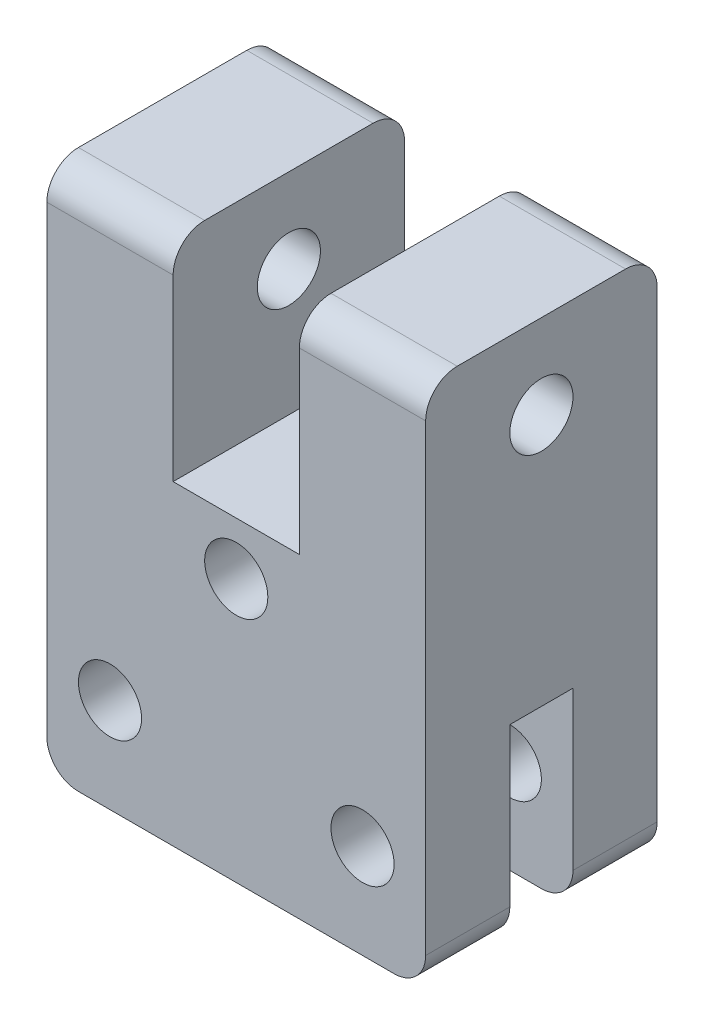
ISO-10303-21;
HEADER;
FILE_DESCRIPTION(('STEP AP214'),'2;1');
FILE_NAME('part.step','',(''),(''),'','','');
FILE_SCHEMA(('AUTOMOTIVE_DESIGN { 1 0 10303 214 1 1 1 1 }'));
ENDSEC;
DATA;
#1=APPLICATION_CONTEXT('core data for automotive mechanical design processes');
#2=APPLICATION_PROTOCOL_DEFINITION('international standard','automotive_design',2000,#1);
#3=PRODUCT_CONTEXT('',#1,'mechanical');
#4=PRODUCT('Part','Part','',(#3));
#5=PRODUCT_RELATED_PRODUCT_CATEGORY('part','',(#4));
#6=PRODUCT_DEFINITION_FORMATION('','',#4);
#7=PRODUCT_DEFINITION_CONTEXT('part definition',#1,'design');
#8=PRODUCT_DEFINITION('design','',#6,#7);
#9=PRODUCT_DEFINITION_SHAPE('','',#8);
#10=(LENGTH_UNIT() NAMED_UNIT(*) SI_UNIT(.MILLI.,.METRE.));
#11=(NAMED_UNIT(*) PLANE_ANGLE_UNIT() SI_UNIT($,.RADIAN.));
#12=(NAMED_UNIT(*) SI_UNIT($,.STERADIAN.) SOLID_ANGLE_UNIT());
#13=UNCERTAINTY_MEASURE_WITH_UNIT(LENGTH_MEASURE(1.E-05),#10,'distance_accuracy_value','');
#14=(GEOMETRIC_REPRESENTATION_CONTEXT(3) GLOBAL_UNCERTAINTY_ASSIGNED_CONTEXT((#13)) GLOBAL_UNIT_ASSIGNED_CONTEXT((#10,
#11,#12)) REPRESENTATION_CONTEXT('',''));
#15=CARTESIAN_POINT('',(0.,0.,0.));
#16=DIRECTION('',(0.,0.,1.));
#17=DIRECTION('',(1.,0.,0.));
#18=AXIS2_PLACEMENT_3D('',#15,#16,#17);
#19=CARTESIAN_POINT('',(-9.,7.5,5.5));
#20=DIRECTION('',(0.,-1.,0.));
#21=DIRECTION('',(0.,0.,-1.));
#22=AXIS2_PLACEMENT_3D('',#19,#20,#21);
#23=PLANE('',#22);
#24=DIRECTION('',(0.,0.,-1.));
#25=VECTOR('',#24,1.);
#26=CARTESIAN_POINT('',(-3.,7.5,-5.5));
#27=LINE('',#26,#25);
#28=CARTESIAN_POINT('',(-3.,7.5,5.5));
#29=VERTEX_POINT('',#28);
#30=CARTESIAN_POINT('',(-3.,7.5,-5.5));
#31=VERTEX_POINT('',#30);
#32=EDGE_CURVE('E227',#29,#31,#27,.T.);
#33=ORIENTED_EDGE('',*,*,#32,.F.);
#34=DIRECTION('',(-1.,0.,0.));
#35=VECTOR('',#34,1.);
#36=CARTESIAN_POINT('',(-9.,7.5,5.5));
#37=LINE('',#36,#35);
#38=CARTESIAN_POINT('',(3.,7.5,5.5));
#39=VERTEX_POINT('',#38);
#40=EDGE_CURVE('E211',#39,#29,#37,.T.);
#41=ORIENTED_EDGE('',*,*,#40,.F.);
#42=DIRECTION('',(0.,0.,1.));
#43=VECTOR('',#42,1.);
#44=CARTESIAN_POINT('',(3.,7.5,-5.5));
#45=LINE('',#44,#43);
#46=CARTESIAN_POINT('',(3.,7.5,-5.5));
#47=VERTEX_POINT('',#46);
#48=EDGE_CURVE('E224',#47,#39,#45,.T.);
#49=ORIENTED_EDGE('',*,*,#48,.F.);
#50=DIRECTION('',(-1.,0.,0.));
#51=VECTOR('',#50,1.);
#52=CARTESIAN_POINT('',(-9.,7.5,-5.5));
#53=LINE('',#52,#51);
#54=EDGE_CURVE('E306',#47,#31,#53,.T.);
#55=ORIENTED_EDGE('',*,*,#54,.T.);
#56=EDGE_LOOP('',(#33,#41,#49,#55));
#57=FACE_BOUND('',#56,.T.);
#58=ADVANCED_FACE('F33',(#57),#23,.F.);
#59=CARTESIAN_POINT('',(-9.,-7.5,5.5));
#60=DIRECTION('',(0.,1.,0.));
#61=DIRECTION('',(0.,0.,1.));
#62=AXIS2_PLACEMENT_3D('',#59,#60,#61);
#63=PLANE('',#62);
#64=DIRECTION('',(1.,0.,0.));
#65=VECTOR('',#64,1.);
#66=CARTESIAN_POINT('',(-9.,-7.5,-5.5));
#67=LINE('',#66,#65);
#68=CARTESIAN_POINT('',(1.5,-7.5,-5.5));
#69=VERTEX_POINT('',#68);
#70=CARTESIAN_POINT('',(7.5,-7.5,-5.5));
#71=VERTEX_POINT('',#70);
#72=EDGE_CURVE('E311',#69,#71,#67,.T.);
#73=ORIENTED_EDGE('',*,*,#72,.T.);
#74=DIRECTION('',(0.,0.,-1.));
#75=VECTOR('',#74,1.);
#76=CARTESIAN_POINT('',(7.5,-7.5,5.5));
#77=LINE('',#76,#75);
#78=CARTESIAN_POINT('',(7.5,-7.5,-1.5));
#79=VERTEX_POINT('',#78);
#80=EDGE_CURVE('E11',#71,#79,#77,.F.);
#81=ORIENTED_EDGE('',*,*,#80,.T.);
#82=DIRECTION('',(1.,0.,0.));
#83=VECTOR('',#82,1.);
#84=CARTESIAN_POINT('',(-9.,-7.5,-1.5));
#85=LINE('',#84,#83);
#86=CARTESIAN_POINT('',(1.5,-7.5,-1.5));
#87=VERTEX_POINT('',#86);
#88=EDGE_CURVE('E278',#87,#79,#85,.T.);
#89=ORIENTED_EDGE('',*,*,#88,.F.);
#90=DIRECTION('',(0.,0.,1.));
#91=VECTOR('',#90,1.);
#92=CARTESIAN_POINT('',(1.5,-7.5,-5.5));
#93=LINE('',#92,#91);
#94=EDGE_CURVE('E271',#69,#87,#93,.T.);
#95=ORIENTED_EDGE('',*,*,#94,.F.);
#96=EDGE_LOOP('',(#73,#81,#89,#95));
#97=FACE_BOUND('',#96,.T.);
#98=ADVANCED_FACE('F488',(#97),#63,.F.);
#99=CARTESIAN_POINT('',(-9.,7.5,5.5));
#100=DIRECTION('',(1.,0.,0.));
#101=DIRECTION('',(0.,0.,-1.));
#102=AXIS2_PLACEMENT_3D('',#99,#100,#101);
#103=PLANE('',#102);
#104=CARTESIAN_POINT('',(-9.,13.5,0.));
#105=DIRECTION('',(1.,0.,0.));
#106=DIRECTION('',(0.,0.,-1.));
#107=AXIS2_PLACEMENT_3D('',#104,#105,#106);
#108=CIRCLE('',#107,1.5);
#109=CARTESIAN_POINT('',(-9.,13.5,-1.5));
#110=VERTEX_POINT('',#109);
#111=EDGE_CURVE('E333',#110,#110,#108,.T.);
#112=ORIENTED_EDGE('',*,*,#111,.T.);
#113=EDGE_LOOP('',(#112));
#114=FACE_BOUND('',#113,.T.);
#115=DIRECTION('',(0.,-1.,0.));
#116=VECTOR('',#115,1.);
#117=CARTESIAN_POINT('',(-9.,7.5,-5.5));
#118=LINE('',#117,#116);
#119=CARTESIAN_POINT('',(-9.,16.,-5.5));
#120=VERTEX_POINT('',#119);
#121=CARTESIAN_POINT('',(-9.,-6.,-5.5));
#122=VERTEX_POINT('',#121);
#123=EDGE_CURVE('E300',#120,#122,#118,.T.);
#124=ORIENTED_EDGE('',*,*,#123,.T.);
#125=DIRECTION('',(0.,0.,-1.));
#126=VECTOR('',#125,1.);
#127=CARTESIAN_POINT('',(-9.,-6.,5.5));
#128=LINE('',#127,#126);
#129=CARTESIAN_POINT('',(-9.,-6.,-1.5));
#130=VERTEX_POINT('',#129);
#131=EDGE_CURVE('E388',#122,#130,#128,.F.);
#132=ORIENTED_EDGE('',*,*,#131,.T.);
#133=DIRECTION('',(0.,-1.,0.));
#134=VECTOR('',#133,1.);
#135=CARTESIAN_POINT('',(-9.,1.5,-1.5));
#136=LINE('',#135,#134);
#137=CARTESIAN_POINT('',(-9.,1.5,-1.5));
#138=VERTEX_POINT('',#137);
#139=EDGE_CURVE('E275',#138,#130,#136,.T.);
#140=ORIENTED_EDGE('',*,*,#139,.F.);
#141=DIRECTION('',(0.,0.,1.));
#142=VECTOR('',#141,1.);
#143=CARTESIAN_POINT('',(-9.,1.5,-1.5));
#144=LINE('',#143,#142);
#145=CARTESIAN_POINT('',(-9.,1.5,1.5));
#146=VERTEX_POINT('',#145);
#147=EDGE_CURVE('E297',#138,#146,#144,.T.);
#148=ORIENTED_EDGE('',*,*,#147,.T.);
#149=DIRECTION('',(0.,-1.,0.));
#150=VECTOR('',#149,1.);
#151=CARTESIAN_POINT('',(-9.,1.5,1.5));
#152=LINE('',#151,#150);
#153=CARTESIAN_POINT('',(-9.,-6.,1.5));
#154=VERTEX_POINT('',#153);
#155=EDGE_CURVE('E261',#146,#154,#152,.T.);
#156=ORIENTED_EDGE('',*,*,#155,.T.);
#157=DIRECTION('',(0.,0.,-1.));
#158=VECTOR('',#157,1.);
#159=CARTESIAN_POINT('',(-9.,-6.,5.5));
#160=LINE('',#159,#158);
#161=CARTESIAN_POINT('',(-9.,-6.,5.5));
#162=VERTEX_POINT('',#161);
#163=EDGE_CURVE('E386',#154,#162,#160,.F.);
#164=ORIENTED_EDGE('',*,*,#163,.T.);
#165=DIRECTION('',(0.,-1.,0.));
#166=VECTOR('',#165,1.);
#167=CARTESIAN_POINT('',(-9.,7.5,5.5));
#168=LINE('',#167,#166);
#169=CARTESIAN_POINT('',(-9.,16.,5.5));
#170=VERTEX_POINT('',#169);
#171=EDGE_CURVE('E303',#170,#162,#168,.T.);
#172=ORIENTED_EDGE('',*,*,#171,.F.);
#173=CARTESIAN_POINT('',(-9.,16.,4.));
#174=DIRECTION('',(1.,0.,0.));
#175=DIRECTION('',(0.,0.,-1.));
#176=AXIS2_PLACEMENT_3D('',#173,#174,#175);
#177=CIRCLE('',#176,1.5);
#178=CARTESIAN_POINT('',(-9.,17.5,4.));
#179=VERTEX_POINT('',#178);
#180=EDGE_CURVE('E357',#170,#179,#177,.F.);
#181=ORIENTED_EDGE('',*,*,#180,.T.);
#182=DIRECTION('',(0.,0.,1.));
#183=VECTOR('',#182,1.);
#184=CARTESIAN_POINT('',(-9.,17.5,-5.5));
#185=LINE('',#184,#183);
#186=CARTESIAN_POINT('',(-9.,17.5,-4.));
#187=VERTEX_POINT('',#186);
#188=EDGE_CURVE('E660',#187,#179,#185,.T.);
#189=ORIENTED_EDGE('',*,*,#188,.F.);
#190=CARTESIAN_POINT('',(-9.,16.,-4.));
#191=DIRECTION('',(1.,0.,0.));
#192=DIRECTION('',(0.,0.,-1.));
#193=AXIS2_PLACEMENT_3D('',#190,#191,#192);
#194=CIRCLE('',#193,1.5);
#195=EDGE_CURVE('E355',#187,#120,#194,.F.);
#196=ORIENTED_EDGE('',*,*,#195,.T.);
#197=EDGE_LOOP('',(#124,#132,#140,#148,#156,#164,#172,#181,#189,#196));
#198=FACE_BOUND('',#197,.T.);
#199=ADVANCED_FACE('F455',(#114,#198),#103,.F.);
#200=CARTESIAN_POINT('',(-7.5,-7.5,-1.5));
#201=VERTEX_POINT('',#200);
#202=CARTESIAN_POINT('',(-1.5,-7.5,-1.5));
#203=VERTEX_POINT('',#202);
#204=EDGE_CURVE('E280',#201,#203,#85,.T.);
#205=ORIENTED_EDGE('',*,*,#204,.F.);
#206=DIRECTION('',(0.,0.,-1.));
#207=VECTOR('',#206,1.);
#208=CARTESIAN_POINT('',(-7.5,-7.5,5.5));
#209=LINE('',#208,#207);
#210=CARTESIAN_POINT('',(-7.5,-7.5,-5.5));
#211=VERTEX_POINT('',#210);
#212=EDGE_CURVE('E379',#201,#211,#209,.T.);
#213=ORIENTED_EDGE('',*,*,#212,.T.);
#214=CARTESIAN_POINT('',(-1.5,-7.5,-5.5));
#215=VERTEX_POINT('',#214);
#216=EDGE_CURVE('E312',#211,#215,#67,.T.);
#217=ORIENTED_EDGE('',*,*,#216,.T.);
#218=DIRECTION('',(0.,0.,1.));
#219=VECTOR('',#218,1.);
#220=CARTESIAN_POINT('',(-1.5,-7.5,-5.5));
#221=LINE('',#220,#219);
#222=EDGE_CURVE('E258',#215,#203,#221,.T.);
#223=ORIENTED_EDGE('',*,*,#222,.T.);
#224=EDGE_LOOP('',(#205,#213,#217,#223));
#225=FACE_BOUND('',#224,.T.);
#226=ADVANCED_FACE('F464',(#225),#63,.F.);
#227=CARTESIAN_POINT('',(9.,7.5,5.5));
#228=DIRECTION('',(-1.,0.,0.));
#229=DIRECTION('',(0.,0.,1.));
#230=AXIS2_PLACEMENT_3D('',#227,#228,#229);
#231=PLANE('',#230);
#232=CARTESIAN_POINT('',(9.,13.5,0.));
#233=DIRECTION('',(1.,0.,0.));
#234=DIRECTION('',(0.,0.,-1.));
#235=AXIS2_PLACEMENT_3D('',#232,#233,#234);
#236=CIRCLE('',#235,1.5);
#237=CARTESIAN_POINT('',(9.,13.5,-1.5));
#238=VERTEX_POINT('',#237);
#239=EDGE_CURVE('E653',#238,#238,#236,.T.);
#240=ORIENTED_EDGE('',*,*,#239,.F.);
#241=EDGE_LOOP('',(#240));
#242=FACE_BOUND('',#241,.T.);
#243=DIRECTION('',(0.,1.,0.));
#244=VECTOR('',#243,1.);
#245=CARTESIAN_POINT('',(9.,1.5,-1.5));
#246=LINE('',#245,#244);
#247=CARTESIAN_POINT('',(9.,-6.,-1.5));
#248=VERTEX_POINT('',#247);
#249=CARTESIAN_POINT('',(9.,1.5,-1.5));
#250=VERTEX_POINT('',#249);
#251=EDGE_CURVE('E282',#248,#250,#246,.T.);
#252=ORIENTED_EDGE('',*,*,#251,.F.);
#253=DIRECTION('',(0.,0.,-1.));
#254=VECTOR('',#253,1.);
#255=CARTESIAN_POINT('',(9.,-6.,5.5));
#256=LINE('',#255,#254);
#257=CARTESIAN_POINT('',(9.,-6.,-5.5));
#258=VERTEX_POINT('',#257);
#259=EDGE_CURVE('E41',#248,#258,#256,.T.);
#260=ORIENTED_EDGE('',*,*,#259,.T.);
#261=DIRECTION('',(0.,1.,0.));
#262=VECTOR('',#261,1.);
#263=CARTESIAN_POINT('',(9.,7.5,-5.5));
#264=LINE('',#263,#262);
#265=CARTESIAN_POINT('',(9.,16.,-5.5));
#266=VERTEX_POINT('',#265);
#267=EDGE_CURVE('E314',#258,#266,#264,.T.);
#268=ORIENTED_EDGE('',*,*,#267,.T.);
#269=CARTESIAN_POINT('',(9.,16.,-4.));
#270=DIRECTION('',(-1.,0.,0.));
#271=DIRECTION('',(0.,0.,1.));
#272=AXIS2_PLACEMENT_3D('',#269,#270,#271);
#273=CIRCLE('',#272,1.5);
#274=CARTESIAN_POINT('',(9.,17.5,-4.));
#275=VERTEX_POINT('',#274);
#276=EDGE_CURVE('E365',#266,#275,#273,.F.);
#277=ORIENTED_EDGE('',*,*,#276,.T.);
#278=DIRECTION('',(0.,0.,-1.));
#279=VECTOR('',#278,1.);
#280=CARTESIAN_POINT('',(9.,17.5,5.5));
#281=LINE('',#280,#279);
#282=CARTESIAN_POINT('',(9.,17.5,4.));
#283=VERTEX_POINT('',#282);
#284=EDGE_CURVE('E233',#283,#275,#281,.T.);
#285=ORIENTED_EDGE('',*,*,#284,.F.);
#286=CARTESIAN_POINT('',(9.,16.,4.));
#287=DIRECTION('',(-1.,0.,0.));
#288=DIRECTION('',(0.,0.,1.));
#289=AXIS2_PLACEMENT_3D('',#286,#287,#288);
#290=CIRCLE('',#289,1.5);
#291=CARTESIAN_POINT('',(9.,16.,5.5));
#292=VERTEX_POINT('',#291);
#293=EDGE_CURVE('E367',#283,#292,#290,.F.);
#294=ORIENTED_EDGE('',*,*,#293,.T.);
#295=DIRECTION('',(0.,1.,0.));
#296=VECTOR('',#295,1.);
#297=CARTESIAN_POINT('',(9.,7.5,5.5));
#298=LINE('',#297,#296);
#299=CARTESIAN_POINT('',(9.,-6.,5.5));
#300=VERTEX_POINT('',#299);
#301=EDGE_CURVE('E229',#300,#292,#298,.T.);
#302=ORIENTED_EDGE('',*,*,#301,.F.);
#303=DIRECTION('',(0.,0.,-1.));
#304=VECTOR('',#303,1.);
#305=CARTESIAN_POINT('',(9.,-6.,5.5));
#306=LINE('',#305,#304);
#307=CARTESIAN_POINT('',(9.,-6.,1.5));
#308=VERTEX_POINT('',#307);
#309=EDGE_CURVE('E405',#300,#308,#306,.T.);
#310=ORIENTED_EDGE('',*,*,#309,.T.);
#311=DIRECTION('',(0.,1.,0.));
#312=VECTOR('',#311,1.);
#313=CARTESIAN_POINT('',(9.,1.5,1.5));
#314=LINE('',#313,#312);
#315=CARTESIAN_POINT('',(9.,1.5,1.5));
#316=VERTEX_POINT('',#315);
#317=EDGE_CURVE('E293',#308,#316,#314,.T.);
#318=ORIENTED_EDGE('',*,*,#317,.T.);
#319=DIRECTION('',(0.,0.,1.));
#320=VECTOR('',#319,1.);
#321=CARTESIAN_POINT('',(9.,1.5,-1.5));
#322=LINE('',#321,#320);
#323=EDGE_CURVE('E287',#250,#316,#322,.T.);
#324=ORIENTED_EDGE('',*,*,#323,.F.);
#325=EDGE_LOOP('',(#252,#260,#268,#277,#285,#294,#302,#310,#318,#324));
#326=FACE_BOUND('',#325,.T.);
#327=ADVANCED_FACE('F411',(#242,#326),#231,.F.);
#328=DIRECTION('',(1.,0.,0.));
#329=VECTOR('',#328,1.);
#330=CARTESIAN_POINT('',(-9.,-7.5,5.5));
#331=LINE('',#330,#329);
#332=CARTESIAN_POINT('',(-7.5,-7.5,5.5));
#333=VERTEX_POINT('',#332);
#334=CARTESIAN_POINT('',(7.5,-7.5,5.5));
#335=VERTEX_POINT('',#334);
#336=EDGE_CURVE('E305',#333,#335,#331,.T.);
#337=ORIENTED_EDGE('',*,*,#336,.F.);
#338=DIRECTION('',(0.,0.,-1.));
#339=VECTOR('',#338,1.);
#340=CARTESIAN_POINT('',(-7.5,-7.5,5.5));
#341=LINE('',#340,#339);
#342=CARTESIAN_POINT('',(-7.5,-7.5,1.5));
#343=VERTEX_POINT('',#342);
#344=EDGE_CURVE('E396',#333,#343,#341,.T.);
#345=ORIENTED_EDGE('',*,*,#344,.T.);
#346=DIRECTION('',(1.,0.,0.));
#347=VECTOR('',#346,1.);
#348=CARTESIAN_POINT('',(-9.,-7.5,1.5));
#349=LINE('',#348,#347);
#350=CARTESIAN_POINT('',(7.5,-7.5,1.5));
#351=VERTEX_POINT('',#350);
#352=EDGE_CURVE('E290',#343,#351,#349,.T.);
#353=ORIENTED_EDGE('',*,*,#352,.T.);
#354=DIRECTION('',(0.,0.,-1.));
#355=VECTOR('',#354,1.);
#356=CARTESIAN_POINT('',(7.5,-7.5,5.5));
#357=LINE('',#356,#355);
#358=EDGE_CURVE('E394',#351,#335,#357,.F.);
#359=ORIENTED_EDGE('',*,*,#358,.T.);
#360=EDGE_LOOP('',(#337,#345,#353,#359));
#361=FACE_BOUND('',#360,.T.);
#362=ADVANCED_FACE('F436',(#361),#63,.F.);
#363=CARTESIAN_POINT('',(0.,0.,5.5));
#364=DIRECTION('',(0.,0.,1.));
#365=DIRECTION('',(1.,0.,0.));
#366=AXIS2_PLACEMENT_3D('',#363,#364,#365);
#367=PLANE('',#366);
#368=CARTESIAN_POINT('',(0.,5.,5.5));
#369=DIRECTION('',(0.,0.,1.));
#370=DIRECTION('',(1.,0.,0.));
#371=AXIS2_PLACEMENT_3D('',#368,#369,#370);
#372=CIRCLE('',#371,1.5);
#373=CARTESIAN_POINT('',(1.5,5.,5.5));
#374=VERTEX_POINT('',#373);
#375=EDGE_CURVE('E893',#374,#374,#372,.T.);
#376=ORIENTED_EDGE('',*,*,#375,.F.);
#377=EDGE_LOOP('',(#376));
#378=FACE_BOUND('',#377,.T.);
#379=CARTESIAN_POINT('',(6.,-3.,5.5));
#380=DIRECTION('',(0.,0.,1.));
#381=DIRECTION('',(1.,0.,0.));
#382=AXIS2_PLACEMENT_3D('',#379,#380,#381);
#383=CIRCLE('',#382,1.5);
#384=CARTESIAN_POINT('',(7.5,-3.,5.5));
#385=VERTEX_POINT('',#384);
#386=EDGE_CURVE('E639',#385,#385,#383,.T.);
#387=ORIENTED_EDGE('',*,*,#386,.F.);
#388=EDGE_LOOP('',(#387));
#389=FACE_BOUND('',#388,.T.);
#390=CARTESIAN_POINT('',(-6.,-3.,5.5));
#391=DIRECTION('',(0.,0.,1.));
#392=DIRECTION('',(1.,0.,0.));
#393=AXIS2_PLACEMENT_3D('',#390,#391,#392);
#394=CIRCLE('',#393,1.5);
#395=CARTESIAN_POINT('',(-4.5,-3.,5.5));
#396=VERTEX_POINT('',#395);
#397=EDGE_CURVE('E640',#396,#396,#394,.T.);
#398=ORIENTED_EDGE('',*,*,#397,.F.);
#399=EDGE_LOOP('',(#398));
#400=FACE_BOUND('',#399,.T.);
#401=ORIENTED_EDGE('',*,*,#171,.T.);
#402=CARTESIAN_POINT('',(-7.5,-6.,5.5));
#403=DIRECTION('',(0.,0.,1.));
#404=DIRECTION('',(1.,0.,0.));
#405=AXIS2_PLACEMENT_3D('',#402,#403,#404);
#406=CIRCLE('',#405,1.5);
#407=EDGE_CURVE('E403',#162,#333,#406,.T.);
#408=ORIENTED_EDGE('',*,*,#407,.T.);
#409=ORIENTED_EDGE('',*,*,#336,.T.);
#410=CARTESIAN_POINT('',(7.5,-6.,5.5));
#411=DIRECTION('',(0.,0.,1.));
#412=DIRECTION('',(1.,0.,0.));
#413=AXIS2_PLACEMENT_3D('',#410,#411,#412);
#414=CIRCLE('',#413,1.5);
#415=EDGE_CURVE('E48',#335,#300,#414,.T.);
#416=ORIENTED_EDGE('',*,*,#415,.T.);
#417=ORIENTED_EDGE('',*,*,#301,.T.);
#418=DIRECTION('',(1.,0.,0.));
#419=VECTOR('',#418,1.);
#420=CARTESIAN_POINT('',(0.,16.,5.5));
#421=LINE('',#420,#419);
#422=CARTESIAN_POINT('',(3.,16.,5.5));
#423=VERTEX_POINT('',#422);
#424=EDGE_CURVE('E213',#292,#423,#421,.F.);
#425=ORIENTED_EDGE('',*,*,#424,.T.);
#426=DIRECTION('',(0.,-1.,0.));
#427=VECTOR('',#426,1.);
#428=CARTESIAN_POINT('',(3.,17.5,5.5));
#429=LINE('',#428,#427);
#430=EDGE_CURVE('E206',#423,#39,#429,.T.);
#431=ORIENTED_EDGE('',*,*,#430,.T.);
#432=ORIENTED_EDGE('',*,*,#40,.T.);
#433=DIRECTION('',(0.,-1.,0.));
#434=VECTOR('',#433,1.);
#435=CARTESIAN_POINT('',(-3.,17.5,5.5));
#436=LINE('',#435,#434);
#437=CARTESIAN_POINT('',(-3.,16.,5.5));
#438=VERTEX_POINT('',#437);
#439=EDGE_CURVE('E234',#438,#29,#436,.T.);
#440=ORIENTED_EDGE('',*,*,#439,.F.);
#441=DIRECTION('',(1.,0.,0.));
#442=VECTOR('',#441,1.);
#443=CARTESIAN_POINT('',(0.,16.,5.5));
#444=LINE('',#443,#442);
#445=EDGE_CURVE('E353',#438,#170,#444,.F.);
#446=ORIENTED_EDGE('',*,*,#445,.T.);
#447=EDGE_LOOP('',(#401,#408,#409,#416,#417,#425,#431,#432,#440,#446));
#448=FACE_BOUND('',#447,.T.);
#449=ADVANCED_FACE('F209',(#378,#389,#400,#448),#367,.T.);
#450=CARTESIAN_POINT('',(0.,0.,-5.5));
#451=DIRECTION('',(0.,0.,1.));
#452=DIRECTION('',(1.,0.,0.));
#453=AXIS2_PLACEMENT_3D('',#450,#451,#452);
#454=PLANE('',#453);
#455=CARTESIAN_POINT('',(6.,-3.,-5.5));
#456=DIRECTION('',(0.,0.,1.));
#457=DIRECTION('',(1.,0.,0.));
#458=AXIS2_PLACEMENT_3D('',#455,#456,#457);
#459=CIRCLE('',#458,1.5);
#460=CARTESIAN_POINT('',(7.5,-3.,-5.5));
#461=VERTEX_POINT('',#460);
#462=EDGE_CURVE('E338',#461,#461,#459,.T.);
#463=ORIENTED_EDGE('',*,*,#462,.T.);
#464=EDGE_LOOP('',(#463));
#465=FACE_BOUND('',#464,.T.);
#466=CARTESIAN_POINT('',(-6.,-3.,-5.5));
#467=DIRECTION('',(0.,0.,1.));
#468=DIRECTION('',(1.,0.,0.));
#469=AXIS2_PLACEMENT_3D('',#466,#467,#468);
#470=CIRCLE('',#469,1.5);
#471=CARTESIAN_POINT('',(-4.5,-3.,-5.5));
#472=VERTEX_POINT('',#471);
#473=EDGE_CURVE('E637',#472,#472,#470,.T.);
#474=ORIENTED_EDGE('',*,*,#473,.T.);
#475=EDGE_LOOP('',(#474));
#476=FACE_BOUND('',#475,.T.);
#477=ORIENTED_EDGE('',*,*,#216,.F.);
#478=CARTESIAN_POINT('',(-7.5,-6.,-5.5));
#479=DIRECTION('',(0.,0.,1.));
#480=DIRECTION('',(1.,0.,0.));
#481=AXIS2_PLACEMENT_3D('',#478,#479,#480);
#482=CIRCLE('',#481,1.5);
#483=EDGE_CURVE('E384',#211,#122,#482,.F.);
#484=ORIENTED_EDGE('',*,*,#483,.T.);
#485=ORIENTED_EDGE('',*,*,#123,.F.);
#486=DIRECTION('',(-1.,0.,0.));
#487=VECTOR('',#486,1.);
#488=CARTESIAN_POINT('',(-3.,16.,-5.5));
#489=LINE('',#488,#487);
#490=CARTESIAN_POINT('',(-3.,16.,-5.5));
#491=VERTEX_POINT('',#490);
#492=EDGE_CURVE('E377',#120,#491,#489,.F.);
#493=ORIENTED_EDGE('',*,*,#492,.T.);
#494=DIRECTION('',(0.,-1.,0.));
#495=VECTOR('',#494,1.);
#496=CARTESIAN_POINT('',(-3.,17.5,-5.5));
#497=LINE('',#496,#495);
#498=EDGE_CURVE('E238',#491,#31,#497,.T.);
#499=ORIENTED_EDGE('',*,*,#498,.T.);
#500=ORIENTED_EDGE('',*,*,#54,.F.);
#501=DIRECTION('',(0.,-1.,0.));
#502=VECTOR('',#501,1.);
#503=CARTESIAN_POINT('',(3.,17.5,-5.5));
#504=LINE('',#503,#502);
#505=CARTESIAN_POINT('',(3.,16.,-5.5));
#506=VERTEX_POINT('',#505);
#507=EDGE_CURVE('E217',#506,#47,#504,.T.);
#508=ORIENTED_EDGE('',*,*,#507,.F.);
#509=DIRECTION('',(-1.,0.,0.));
#510=VECTOR('',#509,1.);
#511=CARTESIAN_POINT('',(9.,16.,-5.5));
#512=LINE('',#511,#510);
#513=EDGE_CURVE('E374',#506,#266,#512,.F.);
#514=ORIENTED_EDGE('',*,*,#513,.T.);
#515=ORIENTED_EDGE('',*,*,#267,.F.);
#516=CARTESIAN_POINT('',(7.5,-6.,-5.5));
#517=DIRECTION('',(0.,0.,1.));
#518=DIRECTION('',(1.,0.,0.));
#519=AXIS2_PLACEMENT_3D('',#516,#517,#518);
#520=CIRCLE('',#519,1.5);
#521=EDGE_CURVE('E382',#258,#71,#520,.F.);
#522=ORIENTED_EDGE('',*,*,#521,.T.);
#523=ORIENTED_EDGE('',*,*,#72,.F.);
#524=DIRECTION('',(0.,1.,0.));
#525=VECTOR('',#524,1.);
#526=CARTESIAN_POINT('',(1.5,-3.,-5.5));
#527=LINE('',#526,#525);
#528=CARTESIAN_POINT('',(1.5,-2.50000000000001,-5.5));
#529=VERTEX_POINT('',#528);
#530=EDGE_CURVE('E246',#69,#529,#527,.T.);
#531=ORIENTED_EDGE('',*,*,#530,.T.);
#532=CARTESIAN_POINT('',(0.5,-2.5,-5.5));
#533=DIRECTION('',(0.,0.,1.));
#534=DIRECTION('',(-1.,0.,0.));
#535=AXIS2_PLACEMENT_3D('',#532,#533,#534);
#536=CIRCLE('',#535,1.);
#537=CARTESIAN_POINT('',(0.499999999999993,-1.5,-5.5));
#538=VERTEX_POINT('',#537);
#539=EDGE_CURVE('E249',#529,#538,#536,.T.);
#540=ORIENTED_EDGE('',*,*,#539,.T.);
#541=DIRECTION('',(-1.,0.,0.));
#542=VECTOR('',#541,1.);
#543=CARTESIAN_POINT('',(0.499999999999993,-1.5,-5.5));
#544=LINE('',#543,#542);
#545=CARTESIAN_POINT('',(-0.499999999999993,-1.5,-5.5));
#546=VERTEX_POINT('',#545);
#547=EDGE_CURVE('E252',#538,#546,#544,.T.);
#548=ORIENTED_EDGE('',*,*,#547,.T.);
#549=CARTESIAN_POINT('',(-0.5,-2.5,-5.5));
#550=DIRECTION('',(0.,0.,1.));
#551=DIRECTION('',(1.,0.,0.));
#552=AXIS2_PLACEMENT_3D('',#549,#550,#551);
#553=CIRCLE('',#552,1.);
#554=CARTESIAN_POINT('',(-1.5,-2.50000000000001,-5.5));
#555=VERTEX_POINT('',#554);
#556=EDGE_CURVE('E255',#546,#555,#553,.T.);
#557=ORIENTED_EDGE('',*,*,#556,.T.);
#558=DIRECTION('',(0.,-1.,0.));
#559=VECTOR('',#558,1.);
#560=CARTESIAN_POINT('',(-1.5,-2.50000000000001,-5.5));
#561=LINE('',#560,#559);
#562=EDGE_CURVE('E243',#555,#215,#561,.T.);
#563=ORIENTED_EDGE('',*,*,#562,.T.);
#564=EDGE_LOOP('',(#477,#484,#485,#493,#499,#500,#508,#514,#515,#522,#523,#531,#540,#548,#557,#563));
#565=FACE_BOUND('',#564,.T.);
#566=ADVANCED_FACE('F417',(#465,#476,#565),#454,.F.);
#567=CARTESIAN_POINT('',(-9.,1.5,-1.5));
#568=DIRECTION('',(0.,1.,0.));
#569=DIRECTION('',(0.,0.,1.));
#570=AXIS2_PLACEMENT_3D('',#567,#568,#569);
#571=PLANE('',#570);
#572=DIRECTION('',(-1.,0.,0.));
#573=VECTOR('',#572,1.);
#574=CARTESIAN_POINT('',(-9.,1.5,1.5));
#575=LINE('',#574,#573);
#576=EDGE_CURVE('E279',#316,#146,#575,.T.);
#577=ORIENTED_EDGE('',*,*,#576,.T.);
#578=ORIENTED_EDGE('',*,*,#147,.F.);
#579=DIRECTION('',(-1.,0.,0.));
#580=VECTOR('',#579,1.);
#581=CARTESIAN_POINT('',(-9.,1.5,-1.5));
#582=LINE('',#581,#580);
#583=EDGE_CURVE('E284',#250,#138,#582,.T.);
#584=ORIENTED_EDGE('',*,*,#583,.F.);
#585=ORIENTED_EDGE('',*,*,#323,.T.);
#586=EDGE_LOOP('',(#577,#578,#584,#585));
#587=FACE_BOUND('',#586,.T.);
#588=ADVANCED_FACE('F449',(#587),#571,.F.);
#589=CARTESIAN_POINT('',(0.,0.,-1.5));
#590=DIRECTION('',(0.,0.,1.));
#591=DIRECTION('',(1.,0.,0.));
#592=AXIS2_PLACEMENT_3D('',#589,#590,#591);
#593=PLANE('',#592);
#594=CARTESIAN_POINT('',(6.,-3.,-1.5));
#595=DIRECTION('',(0.,0.,1.));
#596=DIRECTION('',(1.,0.,0.));
#597=AXIS2_PLACEMENT_3D('',#594,#595,#596);
#598=CIRCLE('',#597,1.5);
#599=CARTESIAN_POINT('',(7.5,-3.,-1.5));
#600=VERTEX_POINT('',#599);
#601=EDGE_CURVE('E342',#600,#600,#598,.T.);
#602=ORIENTED_EDGE('',*,*,#601,.F.);
#603=EDGE_LOOP('',(#602));
#604=FACE_BOUND('',#603,.T.);
#605=CARTESIAN_POINT('',(-6.,-3.,-1.5));
#606=DIRECTION('',(0.,0.,1.));
#607=DIRECTION('',(1.,0.,0.));
#608=AXIS2_PLACEMENT_3D('',#605,#606,#607);
#609=CIRCLE('',#608,1.5);
#610=CARTESIAN_POINT('',(-4.5,-3.,-1.5));
#611=VERTEX_POINT('',#610);
#612=EDGE_CURVE('E337',#611,#611,#609,.T.);
#613=ORIENTED_EDGE('',*,*,#612,.F.);
#614=EDGE_LOOP('',(#613));
#615=FACE_BOUND('',#614,.T.);
#616=ORIENTED_EDGE('',*,*,#139,.T.);
#617=CARTESIAN_POINT('',(-7.5,-6.,-1.5));
#618=DIRECTION('',(0.,0.,1.));
#619=DIRECTION('',(1.,0.,0.));
#620=AXIS2_PLACEMENT_3D('',#617,#618,#619);
#621=CIRCLE('',#620,1.5);
#622=EDGE_CURVE('E392',#130,#201,#621,.T.);
#623=ORIENTED_EDGE('',*,*,#622,.T.);
#624=ORIENTED_EDGE('',*,*,#204,.T.);
#625=DIRECTION('',(0.,-1.,0.));
#626=VECTOR('',#625,1.);
#627=CARTESIAN_POINT('',(-1.5,0.,-1.5));
#628=LINE('',#627,#626);
#629=CARTESIAN_POINT('',(-1.5,-2.50000000000001,-1.5));
#630=VERTEX_POINT('',#629);
#631=EDGE_CURVE('E228',#630,#203,#628,.T.);
#632=ORIENTED_EDGE('',*,*,#631,.F.);
#633=CARTESIAN_POINT('',(-0.5,-2.5,-1.5));
#634=DIRECTION('',(0.,0.,1.));
#635=DIRECTION('',(1.,0.,0.));
#636=AXIS2_PLACEMENT_3D('',#633,#634,#635);
#637=CIRCLE('',#636,1.);
#638=CARTESIAN_POINT('',(-0.499999999999993,-1.5,-1.5));
#639=VERTEX_POINT('',#638);
#640=EDGE_CURVE('E319',#639,#630,#637,.T.);
#641=ORIENTED_EDGE('',*,*,#640,.F.);
#642=DIRECTION('',(-1.,0.,0.));
#643=VECTOR('',#642,1.);
#644=CARTESIAN_POINT('',(0.,-1.5,-1.5));
#645=LINE('',#644,#643);
#646=CARTESIAN_POINT('',(0.499999999999993,-1.5,-1.5));
#647=VERTEX_POINT('',#646);
#648=EDGE_CURVE('E322',#647,#639,#645,.T.);
#649=ORIENTED_EDGE('',*,*,#648,.F.);
#650=CARTESIAN_POINT('',(0.5,-2.5,-1.5));
#651=DIRECTION('',(0.,0.,1.));
#652=DIRECTION('',(1.,0.,0.));
#653=AXIS2_PLACEMENT_3D('',#650,#651,#652);
#654=CIRCLE('',#653,1.);
#655=CARTESIAN_POINT('',(1.5,-2.50000000000001,-1.5));
#656=VERTEX_POINT('',#655);
#657=EDGE_CURVE('E324',#656,#647,#654,.T.);
#658=ORIENTED_EDGE('',*,*,#657,.F.);
#659=DIRECTION('',(0.,1.,0.));
#660=VECTOR('',#659,1.);
#661=CARTESIAN_POINT('',(1.5,0.,-1.5));
#662=LINE('',#661,#660);
#663=EDGE_CURVE('E326',#87,#656,#662,.T.);
#664=ORIENTED_EDGE('',*,*,#663,.F.);
#665=ORIENTED_EDGE('',*,*,#88,.T.);
#666=CARTESIAN_POINT('',(7.5,-6.,-1.5));
#667=DIRECTION('',(0.,0.,1.));
#668=DIRECTION('',(1.,0.,0.));
#669=AXIS2_PLACEMENT_3D('',#666,#667,#668);
#670=CIRCLE('',#669,1.5);
#671=EDGE_CURVE('E390',#79,#248,#670,.T.);
#672=ORIENTED_EDGE('',*,*,#671,.T.);
#673=ORIENTED_EDGE('',*,*,#251,.T.);
#674=ORIENTED_EDGE('',*,*,#583,.T.);
#675=EDGE_LOOP('',(#616,#623,#624,#632,#641,#649,#658,#664,#665,#672,#673,#674));
#676=FACE_BOUND('',#675,.T.);
#677=ADVANCED_FACE('F452',(#604,#615,#676),#593,.T.);
#678=CARTESIAN_POINT('',(0.,0.,1.5));
#679=DIRECTION('',(0.,0.,1.));
#680=DIRECTION('',(1.,0.,0.));
#681=AXIS2_PLACEMENT_3D('',#678,#679,#680);
#682=PLANE('',#681);
#683=CARTESIAN_POINT('',(6.,-3.,1.5));
#684=DIRECTION('',(0.,0.,1.));
#685=DIRECTION('',(1.,0.,0.));
#686=AXIS2_PLACEMENT_3D('',#683,#684,#685);
#687=CIRCLE('',#686,1.5);
#688=CARTESIAN_POINT('',(7.5,-3.,1.5));
#689=VERTEX_POINT('',#688);
#690=EDGE_CURVE('E339',#689,#689,#687,.T.);
#691=ORIENTED_EDGE('',*,*,#690,.T.);
#692=EDGE_LOOP('',(#691));
#693=FACE_BOUND('',#692,.T.);
#694=CARTESIAN_POINT('',(-6.,-3.,1.5));
#695=DIRECTION('',(0.,0.,1.));
#696=DIRECTION('',(1.,0.,0.));
#697=AXIS2_PLACEMENT_3D('',#694,#695,#696);
#698=CIRCLE('',#697,1.5);
#699=CARTESIAN_POINT('',(-4.5,-3.,1.5));
#700=VERTEX_POINT('',#699);
#701=EDGE_CURVE('E334',#700,#700,#698,.T.);
#702=ORIENTED_EDGE('',*,*,#701,.T.);
#703=EDGE_LOOP('',(#702));
#704=FACE_BOUND('',#703,.T.);
#705=ORIENTED_EDGE('',*,*,#352,.F.);
#706=CARTESIAN_POINT('',(-7.5,-6.,1.5));
#707=DIRECTION('',(0.,0.,1.));
#708=DIRECTION('',(1.,0.,0.));
#709=AXIS2_PLACEMENT_3D('',#706,#707,#708);
#710=CIRCLE('',#709,1.5);
#711=EDGE_CURVE('E400',#343,#154,#710,.F.);
#712=ORIENTED_EDGE('',*,*,#711,.T.);
#713=ORIENTED_EDGE('',*,*,#155,.F.);
#714=ORIENTED_EDGE('',*,*,#576,.F.);
#715=ORIENTED_EDGE('',*,*,#317,.F.);
#716=CARTESIAN_POINT('',(7.5,-6.,1.5));
#717=DIRECTION('',(0.,0.,1.));
#718=DIRECTION('',(1.,0.,0.));
#719=AXIS2_PLACEMENT_3D('',#716,#717,#718);
#720=CIRCLE('',#719,1.5);
#721=EDGE_CURVE('E56',#308,#351,#720,.F.);
#722=ORIENTED_EDGE('',*,*,#721,.T.);
#723=EDGE_LOOP('',(#705,#712,#713,#714,#715,#722));
#724=FACE_BOUND('',#723,.T.);
#725=ADVANCED_FACE('F445',(#693,#704,#724),#682,.F.);
#726=CARTESIAN_POINT('',(-0.5,-2.5,-5.5));
#727=DIRECTION('',(0.,0.,1.));
#728=DIRECTION('',(1.,0.,0.));
#729=AXIS2_PLACEMENT_3D('',#726,#727,#728);
#730=CYLINDRICAL_SURFACE('',#729,1.);
#731=ORIENTED_EDGE('',*,*,#640,.T.);
#732=DIRECTION('',(0.,0.,1.));
#733=VECTOR('',#732,1.);
#734=CARTESIAN_POINT('',(-1.5,-2.50000000000001,-5.5));
#735=LINE('',#734,#733);
#736=EDGE_CURVE('E259',#555,#630,#735,.T.);
#737=ORIENTED_EDGE('',*,*,#736,.F.);
#738=ORIENTED_EDGE('',*,*,#556,.F.);
#739=DIRECTION('',(0.,0.,1.));
#740=VECTOR('',#739,1.);
#741=CARTESIAN_POINT('',(-0.499999999999993,-1.5,-5.5));
#742=LINE('',#741,#740);
#743=EDGE_CURVE('E262',#546,#639,#742,.T.);
#744=ORIENTED_EDGE('',*,*,#743,.T.);
#745=EDGE_LOOP('',(#731,#737,#738,#744));
#746=FACE_BOUND('',#745,.T.);
#747=ADVANCED_FACE('F472',(#746),#730,.F.);
#748=CARTESIAN_POINT('',(0.499999999999993,-1.5,-5.5));
#749=DIRECTION('',(0.,1.,0.));
#750=DIRECTION('',(-1.,0.,0.));
#751=AXIS2_PLACEMENT_3D('',#748,#749,#750);
#752=PLANE('',#751);
#753=ORIENTED_EDGE('',*,*,#648,.T.);
#754=ORIENTED_EDGE('',*,*,#743,.F.);
#755=ORIENTED_EDGE('',*,*,#547,.F.);
#756=DIRECTION('',(0.,0.,1.));
#757=VECTOR('',#756,1.);
#758=CARTESIAN_POINT('',(0.499999999999993,-1.5,-5.5));
#759=LINE('',#758,#757);
#760=EDGE_CURVE('E265',#538,#647,#759,.T.);
#761=ORIENTED_EDGE('',*,*,#760,.T.);
#762=EDGE_LOOP('',(#753,#754,#755,#761));
#763=FACE_BOUND('',#762,.T.);
#764=ADVANCED_FACE('F478',(#763),#752,.F.);
#765=CARTESIAN_POINT('',(0.5,-2.5,-5.5));
#766=DIRECTION('',(0.,0.,1.));
#767=DIRECTION('',(1.,0.,0.));
#768=AXIS2_PLACEMENT_3D('',#765,#766,#767);
#769=CYLINDRICAL_SURFACE('',#768,1.);
#770=ORIENTED_EDGE('',*,*,#657,.T.);
#771=ORIENTED_EDGE('',*,*,#760,.F.);
#772=ORIENTED_EDGE('',*,*,#539,.F.);
#773=DIRECTION('',(0.,0.,1.));
#774=VECTOR('',#773,1.);
#775=CARTESIAN_POINT('',(1.5,-2.50000000000001,-5.5));
#776=LINE('',#775,#774);
#777=EDGE_CURVE('E268',#529,#656,#776,.T.);
#778=ORIENTED_EDGE('',*,*,#777,.T.);
#779=EDGE_LOOP('',(#770,#771,#772,#778));
#780=FACE_BOUND('',#779,.T.);
#781=ADVANCED_FACE('F481',(#780),#769,.F.);
#782=CARTESIAN_POINT('',(1.5,-2.50000000000001,-5.5));
#783=DIRECTION('',(1.,0.,0.));
#784=DIRECTION('',(0.,0.,-1.));
#785=AXIS2_PLACEMENT_3D('',#782,#783,#784);
#786=PLANE('',#785);
#787=ORIENTED_EDGE('',*,*,#663,.T.);
#788=ORIENTED_EDGE('',*,*,#777,.F.);
#789=ORIENTED_EDGE('',*,*,#530,.F.);
#790=ORIENTED_EDGE('',*,*,#94,.T.);
#791=EDGE_LOOP('',(#787,#788,#789,#790));
#792=FACE_BOUND('',#791,.T.);
#793=ADVANCED_FACE('F483',(#792),#786,.F.);
#794=CARTESIAN_POINT('',(-1.5,-3.,-5.5));
#795=DIRECTION('',(-1.,0.,0.));
#796=DIRECTION('',(0.,-1.,0.));
#797=AXIS2_PLACEMENT_3D('',#794,#795,#796);
#798=PLANE('',#797);
#799=ORIENTED_EDGE('',*,*,#631,.T.);
#800=ORIENTED_EDGE('',*,*,#222,.F.);
#801=ORIENTED_EDGE('',*,*,#562,.F.);
#802=ORIENTED_EDGE('',*,*,#736,.T.);
#803=EDGE_LOOP('',(#799,#800,#801,#802));
#804=FACE_BOUND('',#803,.T.);
#805=ADVANCED_FACE('F468',(#804),#798,.F.);
#806=CARTESIAN_POINT('',(3.,17.5,-5.5));
#807=DIRECTION('',(1.,0.,0.));
#808=DIRECTION('',(0.,0.,-1.));
#809=AXIS2_PLACEMENT_3D('',#806,#807,#808);
#810=PLANE('',#809);
#811=CARTESIAN_POINT('',(3.,13.5,0.));
#812=DIRECTION('',(1.,0.,0.));
#813=DIRECTION('',(0.,0.,-1.));
#814=AXIS2_PLACEMENT_3D('',#811,#812,#813);
#815=CIRCLE('',#814,1.5);
#816=CARTESIAN_POINT('',(3.,13.5,-1.5));
#817=VERTEX_POINT('',#816);
#818=EDGE_CURVE('E332',#817,#817,#815,.T.);
#819=ORIENTED_EDGE('',*,*,#818,.T.);
#820=EDGE_LOOP('',(#819));
#821=FACE_BOUND('',#820,.T.);
#822=ORIENTED_EDGE('',*,*,#430,.F.);
#823=CARTESIAN_POINT('',(3.,16.,4.));
#824=DIRECTION('',(1.,0.,0.));
#825=DIRECTION('',(0.,0.,-1.));
#826=AXIS2_PLACEMENT_3D('',#823,#824,#825);
#827=CIRCLE('',#826,1.5);
#828=CARTESIAN_POINT('',(3.,17.5,4.));
#829=VERTEX_POINT('',#828);
#830=EDGE_CURVE('E372',#423,#829,#827,.F.);
#831=ORIENTED_EDGE('',*,*,#830,.T.);
#832=DIRECTION('',(0.,0.,1.));
#833=VECTOR('',#832,1.);
#834=CARTESIAN_POINT('',(3.,17.5,-5.5));
#835=LINE('',#834,#833);
#836=CARTESIAN_POINT('',(3.,17.5,-4.));
#837=VERTEX_POINT('',#836);
#838=EDGE_CURVE('E218',#837,#829,#835,.T.);
#839=ORIENTED_EDGE('',*,*,#838,.F.);
#840=CARTESIAN_POINT('',(3.,16.,-4.));
#841=DIRECTION('',(1.,0.,0.));
#842=DIRECTION('',(0.,0.,-1.));
#843=AXIS2_PLACEMENT_3D('',#840,#841,#842);
#844=CIRCLE('',#843,1.5);
#845=EDGE_CURVE('E370',#837,#506,#844,.F.);
#846=ORIENTED_EDGE('',*,*,#845,.T.);
#847=ORIENTED_EDGE('',*,*,#507,.T.);
#848=ORIENTED_EDGE('',*,*,#48,.T.);
#849=EDGE_LOOP('',(#822,#831,#839,#846,#847,#848));
#850=FACE_BOUND('',#849,.T.);
#851=ADVANCED_FACE('F231',(#821,#850),#810,.F.);
#852=CARTESIAN_POINT('',(0.,17.5,0.));
#853=DIRECTION('',(0.,1.,0.));
#854=DIRECTION('',(0.,0.,1.));
#855=AXIS2_PLACEMENT_3D('',#852,#853,#854);
#856=PLANE('',#855);
#857=ORIENTED_EDGE('',*,*,#838,.T.);
#858=DIRECTION('',(1.,0.,0.));
#859=VECTOR('',#858,1.);
#860=CARTESIAN_POINT('',(0.,17.5,4.));
#861=LINE('',#860,#859);
#862=EDGE_CURVE('E362',#829,#283,#861,.T.);
#863=ORIENTED_EDGE('',*,*,#862,.T.);
#864=ORIENTED_EDGE('',*,*,#284,.T.);
#865=DIRECTION('',(-1.,0.,0.));
#866=VECTOR('',#865,1.);
#867=CARTESIAN_POINT('',(3.,17.5,-4.));
#868=LINE('',#867,#866);
#869=EDGE_CURVE('E359',#275,#837,#868,.T.);
#870=ORIENTED_EDGE('',*,*,#869,.T.);
#871=EDGE_LOOP('',(#857,#863,#864,#870));
#872=FACE_BOUND('',#871,.T.);
#873=ADVANCED_FACE('F428',(#872),#856,.T.);
#874=CARTESIAN_POINT('',(-3.,17.5,-5.5));
#875=DIRECTION('',(-1.,0.,0.));
#876=DIRECTION('',(0.,0.,1.));
#877=AXIS2_PLACEMENT_3D('',#874,#875,#876);
#878=PLANE('',#877);
#879=CARTESIAN_POINT('',(-3.,13.5,0.));
#880=DIRECTION('',(-1.,0.,0.));
#881=DIRECTION('',(0.,0.,1.));
#882=AXIS2_PLACEMENT_3D('',#879,#880,#881);
#883=CIRCLE('',#882,1.5);
#884=CARTESIAN_POINT('',(-3.,13.5,1.5));
#885=VERTEX_POINT('',#884);
#886=EDGE_CURVE('E329',#885,#885,#883,.T.);
#887=ORIENTED_EDGE('',*,*,#886,.T.);
#888=EDGE_LOOP('',(#887));
#889=FACE_BOUND('',#888,.T.);
#890=DIRECTION('',(0.,0.,-1.));
#891=VECTOR('',#890,1.);
#892=CARTESIAN_POINT('',(-3.,17.5,-5.5));
#893=LINE('',#892,#891);
#894=CARTESIAN_POINT('',(-3.,17.5,4.));
#895=VERTEX_POINT('',#894);
#896=CARTESIAN_POINT('',(-3.,17.5,-4.));
#897=VERTEX_POINT('',#896);
#898=EDGE_CURVE('E663',#895,#897,#893,.T.);
#899=ORIENTED_EDGE('',*,*,#898,.F.);
#900=CARTESIAN_POINT('',(-3.,16.,4.));
#901=DIRECTION('',(-1.,0.,0.));
#902=DIRECTION('',(0.,0.,1.));
#903=AXIS2_PLACEMENT_3D('',#900,#901,#902);
#904=CIRCLE('',#903,1.5);
#905=EDGE_CURVE('E350',#895,#438,#904,.F.);
#906=ORIENTED_EDGE('',*,*,#905,.T.);
#907=ORIENTED_EDGE('',*,*,#439,.T.);
#908=ORIENTED_EDGE('',*,*,#32,.T.);
#909=ORIENTED_EDGE('',*,*,#498,.F.);
#910=CARTESIAN_POINT('',(-3.,16.,-4.));
#911=DIRECTION('',(-1.,0.,0.));
#912=DIRECTION('',(0.,0.,1.));
#913=AXIS2_PLACEMENT_3D('',#910,#911,#912);
#914=CIRCLE('',#913,1.5);
#915=EDGE_CURVE('E348',#491,#897,#914,.F.);
#916=ORIENTED_EDGE('',*,*,#915,.T.);
#917=EDGE_LOOP('',(#899,#906,#907,#908,#909,#916));
#918=FACE_BOUND('',#917,.T.);
#919=ADVANCED_FACE('F600',(#889,#918),#878,.F.);
#920=CARTESIAN_POINT('',(0.,17.5,0.));
#921=DIRECTION('',(0.,1.,0.));
#922=DIRECTION('',(0.,0.,1.));
#923=AXIS2_PLACEMENT_3D('',#920,#921,#922);
#924=PLANE('',#923);
#925=ORIENTED_EDGE('',*,*,#188,.T.);
#926=DIRECTION('',(1.,0.,0.));
#927=VECTOR('',#926,1.);
#928=CARTESIAN_POINT('',(0.,17.5,4.));
#929=LINE('',#928,#927);
#930=EDGE_CURVE('E345',#179,#895,#929,.T.);
#931=ORIENTED_EDGE('',*,*,#930,.T.);
#932=ORIENTED_EDGE('',*,*,#898,.T.);
#933=DIRECTION('',(-1.,0.,0.));
#934=VECTOR('',#933,1.);
#935=CARTESIAN_POINT('',(-9.,17.5,-4.));
#936=LINE('',#935,#934);
#937=EDGE_CURVE('E328',#897,#187,#936,.T.);
#938=ORIENTED_EDGE('',*,*,#937,.T.);
#939=EDGE_LOOP('',(#925,#931,#932,#938));
#940=FACE_BOUND('',#939,.T.);
#941=ADVANCED_FACE('F597',(#940),#924,.T.);
#942=CARTESIAN_POINT('',(-9.,13.5,0.));
#943=DIRECTION('',(1.,0.,0.));
#944=DIRECTION('',(0.,0.,-1.));
#945=AXIS2_PLACEMENT_3D('',#942,#943,#944);
#946=CYLINDRICAL_SURFACE('',#945,1.5);
#947=ORIENTED_EDGE('',*,*,#111,.F.);
#948=EDGE_LOOP('',(#947));
#949=FACE_BOUND('',#948,.T.);
#950=ORIENTED_EDGE('',*,*,#886,.F.);
#951=EDGE_LOOP('',(#950));
#952=FACE_BOUND('',#951,.T.);
#953=ADVANCED_FACE('F595',(#949,#952),#946,.F.);
#954=ORIENTED_EDGE('',*,*,#239,.T.);
#955=EDGE_LOOP('',(#954));
#956=FACE_BOUND('',#955,.T.);
#957=ORIENTED_EDGE('',*,*,#818,.F.);
#958=EDGE_LOOP('',(#957));
#959=FACE_BOUND('',#958,.T.);
#960=ADVANCED_FACE('F592',(#956,#959),#946,.F.);
#961=CARTESIAN_POINT('',(-6.,-3.,-5.5));
#962=DIRECTION('',(0.,0.,1.));
#963=DIRECTION('',(1.,0.,0.));
#964=AXIS2_PLACEMENT_3D('',#961,#962,#963);
#965=CYLINDRICAL_SURFACE('',#964,1.5);
#966=ORIENTED_EDGE('',*,*,#397,.T.);
#967=EDGE_LOOP('',(#966));
#968=FACE_BOUND('',#967,.T.);
#969=ORIENTED_EDGE('',*,*,#701,.F.);
#970=EDGE_LOOP('',(#969));
#971=FACE_BOUND('',#970,.T.);
#972=ADVANCED_FACE('F591',(#968,#971),#965,.F.);
#973=CARTESIAN_POINT('',(6.,-3.,-5.5));
#974=DIRECTION('',(0.,0.,1.));
#975=DIRECTION('',(1.,0.,0.));
#976=AXIS2_PLACEMENT_3D('',#973,#974,#975);
#977=CYLINDRICAL_SURFACE('',#976,1.5);
#978=ORIENTED_EDGE('',*,*,#386,.T.);
#979=EDGE_LOOP('',(#978));
#980=FACE_BOUND('',#979,.T.);
#981=ORIENTED_EDGE('',*,*,#690,.F.);
#982=EDGE_LOOP('',(#981));
#983=FACE_BOUND('',#982,.T.);
#984=ADVANCED_FACE('F587',(#980,#983),#977,.F.);
#985=ORIENTED_EDGE('',*,*,#612,.T.);
#986=EDGE_LOOP('',(#985));
#987=FACE_BOUND('',#986,.T.);
#988=ORIENTED_EDGE('',*,*,#473,.F.);
#989=EDGE_LOOP('',(#988));
#990=FACE_BOUND('',#989,.T.);
#991=ADVANCED_FACE('F585',(#987,#990),#965,.F.);
#992=ORIENTED_EDGE('',*,*,#601,.T.);
#993=EDGE_LOOP('',(#992));
#994=FACE_BOUND('',#993,.T.);
#995=ORIENTED_EDGE('',*,*,#462,.F.);
#996=EDGE_LOOP('',(#995));
#997=FACE_BOUND('',#996,.T.);
#998=ADVANCED_FACE('F517',(#994,#997),#977,.F.);
#999=CARTESIAN_POINT('',(0.,16.,4.));
#1000=DIRECTION('',(1.,0.,0.));
#1001=DIRECTION('',(0.,0.,-1.));
#1002=AXIS2_PLACEMENT_3D('',#999,#1000,#1001);
#1003=CYLINDRICAL_SURFACE('',#1002,1.5);
#1004=ORIENTED_EDGE('',*,*,#180,.F.);
#1005=ORIENTED_EDGE('',*,*,#445,.F.);
#1006=ORIENTED_EDGE('',*,*,#905,.F.);
#1007=ORIENTED_EDGE('',*,*,#930,.F.);
#1008=EDGE_LOOP('',(#1004,#1005,#1006,#1007));
#1009=FACE_BOUND('',#1008,.T.);
#1010=ADVANCED_FACE('F514',(#1009),#1003,.T.);
#1011=CARTESIAN_POINT('',(0.,16.,4.));
#1012=DIRECTION('',(1.,0.,0.));
#1013=DIRECTION('',(0.,0.,-1.));
#1014=AXIS2_PLACEMENT_3D('',#1011,#1012,#1013);
#1015=CYLINDRICAL_SURFACE('',#1014,1.5);
#1016=ORIENTED_EDGE('',*,*,#830,.F.);
#1017=ORIENTED_EDGE('',*,*,#424,.F.);
#1018=ORIENTED_EDGE('',*,*,#293,.F.);
#1019=ORIENTED_EDGE('',*,*,#862,.F.);
#1020=EDGE_LOOP('',(#1016,#1017,#1018,#1019));
#1021=FACE_BOUND('',#1020,.T.);
#1022=ADVANCED_FACE('F432',(#1021),#1015,.T.);
#1023=CARTESIAN_POINT('',(0.,16.,-4.));
#1024=DIRECTION('',(1.,0.,0.));
#1025=DIRECTION('',(0.,0.,-1.));
#1026=AXIS2_PLACEMENT_3D('',#1023,#1024,#1025);
#1027=CYLINDRICAL_SURFACE('',#1026,1.5);
#1028=ORIENTED_EDGE('',*,*,#915,.F.);
#1029=ORIENTED_EDGE('',*,*,#492,.F.);
#1030=ORIENTED_EDGE('',*,*,#195,.F.);
#1031=ORIENTED_EDGE('',*,*,#937,.F.);
#1032=EDGE_LOOP('',(#1028,#1029,#1030,#1031));
#1033=FACE_BOUND('',#1032,.T.);
#1034=ADVANCED_FACE('F521',(#1033),#1027,.T.);
#1035=CARTESIAN_POINT('',(0.,16.,-4.));
#1036=DIRECTION('',(1.,0.,0.));
#1037=DIRECTION('',(0.,0.,-1.));
#1038=AXIS2_PLACEMENT_3D('',#1035,#1036,#1037);
#1039=CYLINDRICAL_SURFACE('',#1038,1.5);
#1040=ORIENTED_EDGE('',*,*,#276,.F.);
#1041=ORIENTED_EDGE('',*,*,#513,.F.);
#1042=ORIENTED_EDGE('',*,*,#845,.F.);
#1043=ORIENTED_EDGE('',*,*,#869,.F.);
#1044=EDGE_LOOP('',(#1040,#1041,#1042,#1043));
#1045=FACE_BOUND('',#1044,.T.);
#1046=ADVANCED_FACE('F424',(#1045),#1039,.T.);
#1047=CARTESIAN_POINT('',(-7.5,-6.,5.5));
#1048=DIRECTION('',(0.,0.,-1.));
#1049=DIRECTION('',(-1.,0.,0.));
#1050=AXIS2_PLACEMENT_3D('',#1047,#1048,#1049);
#1051=CYLINDRICAL_SURFACE('',#1050,1.5);
#1052=ORIENTED_EDGE('',*,*,#622,.F.);
#1053=ORIENTED_EDGE('',*,*,#131,.F.);
#1054=ORIENTED_EDGE('',*,*,#483,.F.);
#1055=ORIENTED_EDGE('',*,*,#212,.F.);
#1056=EDGE_LOOP('',(#1052,#1053,#1054,#1055));
#1057=FACE_BOUND('',#1056,.T.);
#1058=ADVANCED_FACE('F459',(#1057),#1051,.T.);
#1059=CARTESIAN_POINT('',(-7.5,-6.,5.5));
#1060=DIRECTION('',(0.,0.,-1.));
#1061=DIRECTION('',(-1.,0.,0.));
#1062=AXIS2_PLACEMENT_3D('',#1059,#1060,#1061);
#1063=CYLINDRICAL_SURFACE('',#1062,1.5);
#1064=ORIENTED_EDGE('',*,*,#407,.F.);
#1065=ORIENTED_EDGE('',*,*,#163,.F.);
#1066=ORIENTED_EDGE('',*,*,#711,.F.);
#1067=ORIENTED_EDGE('',*,*,#344,.F.);
#1068=EDGE_LOOP('',(#1064,#1065,#1066,#1067));
#1069=FACE_BOUND('',#1068,.T.);
#1070=ADVANCED_FACE('F443',(#1069),#1063,.T.);
#1071=CARTESIAN_POINT('',(7.5,-6.,5.5));
#1072=DIRECTION('',(0.,0.,-1.));
#1073=DIRECTION('',(-1.,0.,0.));
#1074=AXIS2_PLACEMENT_3D('',#1071,#1072,#1073);
#1075=CYLINDRICAL_SURFACE('',#1074,1.5);
#1076=ORIENTED_EDGE('',*,*,#671,.F.);
#1077=ORIENTED_EDGE('',*,*,#80,.F.);
#1078=ORIENTED_EDGE('',*,*,#521,.F.);
#1079=ORIENTED_EDGE('',*,*,#259,.F.);
#1080=EDGE_LOOP('',(#1076,#1077,#1078,#1079));
#1081=FACE_BOUND('',#1080,.T.);
#1082=ADVANCED_FACE('F490',(#1081),#1075,.T.);
#1083=CARTESIAN_POINT('',(7.5,-6.,5.5));
#1084=DIRECTION('',(0.,0.,-1.));
#1085=DIRECTION('',(-1.,0.,0.));
#1086=AXIS2_PLACEMENT_3D('',#1083,#1084,#1085);
#1087=CYLINDRICAL_SURFACE('',#1086,1.5);
#1088=ORIENTED_EDGE('',*,*,#415,.F.);
#1089=ORIENTED_EDGE('',*,*,#358,.F.);
#1090=ORIENTED_EDGE('',*,*,#721,.F.);
#1091=ORIENTED_EDGE('',*,*,#309,.F.);
#1092=EDGE_LOOP('',(#1088,#1089,#1090,#1091));
#1093=FACE_BOUND('',#1092,.T.);
#1094=ADVANCED_FACE('F35',(#1093),#1087,.T.);
#1095=CARTESIAN_POINT('',(0.,5.,-4.5));
#1096=DIRECTION('',(0.,0.,1.));
#1097=DIRECTION('',(1.,0.,0.));
#1098=AXIS2_PLACEMENT_3D('',#1095,#1096,#1097);
#1099=CYLINDRICAL_SURFACE('',#1098,1.5);
#1100=CARTESIAN_POINT('',(0.,5.,-4.5));
#1101=DIRECTION('',(0.,0.,1.));
#1102=DIRECTION('',(1.,0.,0.));
#1103=AXIS2_PLACEMENT_3D('',#1100,#1101,#1102);
#1104=CIRCLE('',#1103,1.5);
#1105=CARTESIAN_POINT('',(1.5,5.,-4.5));
#1106=VERTEX_POINT('',#1105);
#1107=EDGE_CURVE('E645',#1106,#1106,#1104,.T.);
#1108=ORIENTED_EDGE('',*,*,#1107,.F.);
#1109=EDGE_LOOP('',(#1108));
#1110=FACE_BOUND('',#1109,.T.);
#1111=ORIENTED_EDGE('',*,*,#375,.T.);
#1112=EDGE_LOOP('',(#1111));
#1113=FACE_BOUND('',#1112,.T.);
#1114=ADVANCED_FACE('F496',(#1110,#1113),#1099,.F.);
#1115=CARTESIAN_POINT('',(0.,5.,-4.5));
#1116=DIRECTION('',(0.,0.,1.));
#1117=DIRECTION('',(1.,0.,0.));
#1118=AXIS2_PLACEMENT_3D('',#1115,#1116,#1117);
#1119=PLANE('',#1118);
#1120=ORIENTED_EDGE('',*,*,#1107,.T.);
#1121=EDGE_LOOP('',(#1120));
#1122=FACE_BOUND('',#1121,.T.);
#1123=ADVANCED_FACE('F567',(#1122),#1119,.T.);
#1124=CLOSED_SHELL('',(#58,#98,#199,#226,#327,#362,#449,#566,#588,#677,#725,#747,#764,#781,#793,
#805,#851,#873,#919,#941,#953,#960,#972,#984,#991,#998,#1010,#1022,#1034,#1046,#1058,#1070,
#1082,#1094,#1114,#1123));
#1125=MANIFOLD_SOLID_BREP('B2',#1124);
#1126=ADVANCED_BREP_SHAPE_REPRESENTATION('',(#18,#1125),#14);
#1127=SHAPE_DEFINITION_REPRESENTATION(#9,#1126);
ENDSEC;
END-ISO-10303-21;
